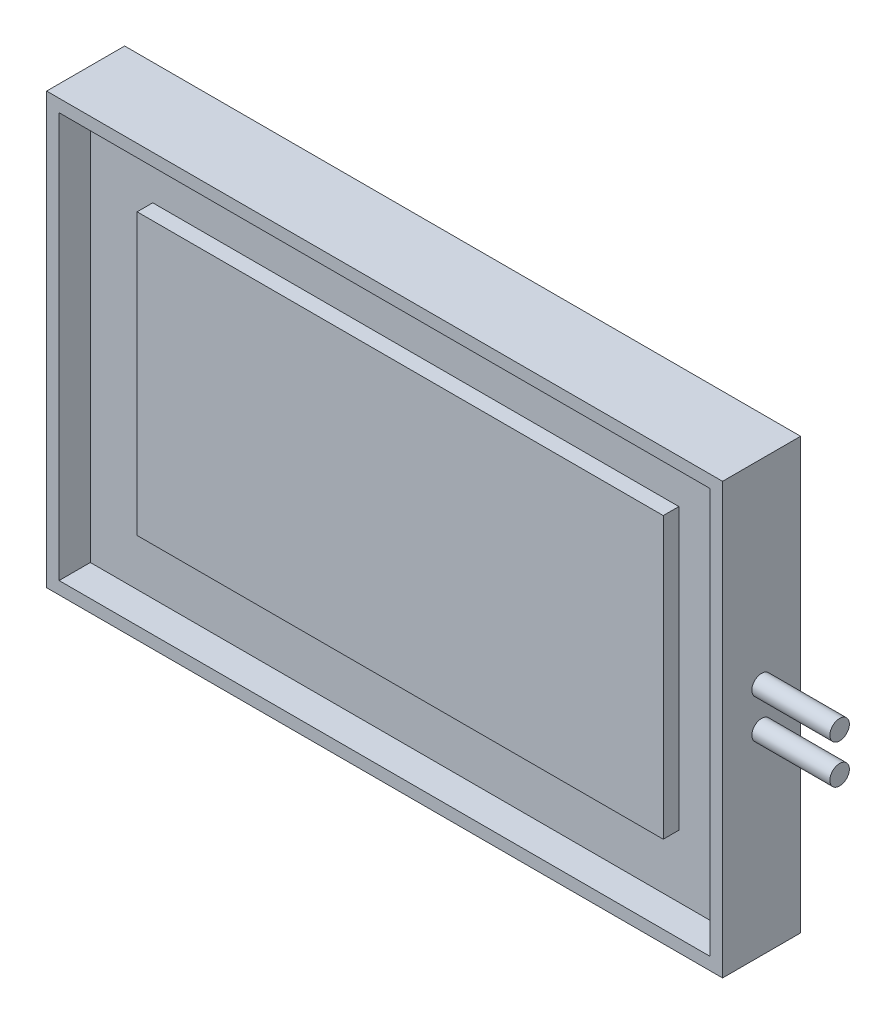
ISO-10303-21;
HEADER;
FILE_DESCRIPTION(('STEP AP214'),'2;1');
FILE_NAME('part.step','',(''),(''),'','','');
FILE_SCHEMA(('AUTOMOTIVE_DESIGN { 1 0 10303 214 1 1 1 1 }'));
ENDSEC;
DATA;
#1=APPLICATION_CONTEXT('core data for automotive mechanical design processes');
#2=APPLICATION_PROTOCOL_DEFINITION('international standard','automotive_design',2000,#1);
#3=PRODUCT_CONTEXT('',#1,'mechanical');
#4=PRODUCT('Part','Part','',(#3));
#5=PRODUCT_RELATED_PRODUCT_CATEGORY('part','',(#4));
#6=PRODUCT_DEFINITION_FORMATION('','',#4);
#7=PRODUCT_DEFINITION_CONTEXT('part definition',#1,'design');
#8=PRODUCT_DEFINITION('design','',#6,#7);
#9=PRODUCT_DEFINITION_SHAPE('','',#8);
#10=(LENGTH_UNIT() NAMED_UNIT(*) SI_UNIT(.MILLI.,.METRE.));
#11=(NAMED_UNIT(*) PLANE_ANGLE_UNIT() SI_UNIT($,.RADIAN.));
#12=(NAMED_UNIT(*) SI_UNIT($,.STERADIAN.) SOLID_ANGLE_UNIT());
#13=UNCERTAINTY_MEASURE_WITH_UNIT(LENGTH_MEASURE(1.E-05),#10,'distance_accuracy_value','');
#14=(GEOMETRIC_REPRESENTATION_CONTEXT(3) GLOBAL_UNCERTAINTY_ASSIGNED_CONTEXT((#13)) GLOBAL_UNIT_ASSIGNED_CONTEXT((#10,
#11,#12)) REPRESENTATION_CONTEXT('',''));
#15=CARTESIAN_POINT('',(0.,0.,0.));
#16=DIRECTION('',(0.,0.,1.));
#17=DIRECTION('',(1.,0.,0.));
#18=AXIS2_PLACEMENT_3D('',#15,#16,#17);
#19=CARTESIAN_POINT('',(0.,0.,3.81));
#20=DIRECTION('',(0.,0.,1.));
#21=DIRECTION('',(1.,0.,0.));
#22=AXIS2_PLACEMENT_3D('',#19,#20,#21);
#23=PLANE('',#22);
#24=DIRECTION('',(0.,1.,0.));
#25=VECTOR('',#24,1.);
#26=CARTESIAN_POINT('',(-29.7623768115942,-0.393420289855083,3.81));
#27=LINE('',#26,#25);
#28=CARTESIAN_POINT('',(-29.7623768115942,-0.393420289855083,3.81));
#29=VERTEX_POINT('',#28);
#30=CARTESIAN_POINT('',(-29.7623768115942,32.5745797101449,3.81));
#31=VERTEX_POINT('',#30);
#32=EDGE_CURVE('E157',#29,#31,#27,.T.);
#33=ORIENTED_EDGE('',*,*,#32,.T.);
#34=DIRECTION('',(-1.,0.,0.));
#35=VECTOR('',#34,1.);
#36=CARTESIAN_POINT('',(-29.7623768115942,32.5745797101449,3.81));
#37=LINE('',#36,#35);
#38=CARTESIAN_POINT('',(-82.7303768115942,32.5745797101449,3.81));
#39=VERTEX_POINT('',#38);
#40=EDGE_CURVE('E160',#31,#39,#37,.T.);
#41=ORIENTED_EDGE('',*,*,#40,.T.);
#42=DIRECTION('',(0.,-1.,0.));
#43=VECTOR('',#42,1.);
#44=CARTESIAN_POINT('',(-82.7303768115942,32.5745797101449,3.81));
#45=LINE('',#44,#43);
#46=CARTESIAN_POINT('',(-82.7303768115942,-0.393420289855086,3.81));
#47=VERTEX_POINT('',#46);
#48=EDGE_CURVE('E164',#39,#47,#45,.T.);
#49=ORIENTED_EDGE('',*,*,#48,.T.);
#50=DIRECTION('',(1.,0.,0.));
#51=VECTOR('',#50,1.);
#52=CARTESIAN_POINT('',(-82.7303768115942,-0.393420289855086,3.81));
#53=LINE('',#52,#51);
#54=EDGE_CURVE('E167',#47,#29,#53,.T.);
#55=ORIENTED_EDGE('',*,*,#54,.T.);
#56=EDGE_LOOP('',(#33,#41,#49,#55));
#57=FACE_BOUND('',#56,.T.);
#58=DIRECTION('',(-1.,0.,0.));
#59=VECTOR('',#58,1.);
#60=CARTESIAN_POINT('',(-34.8423768115942,27.4945797101449,3.81));
#61=LINE('',#60,#59);
#62=CARTESIAN_POINT('',(-34.8423768115942,27.4945797101449,3.81));
#63=VERTEX_POINT('',#62);
#64=CARTESIAN_POINT('',(-77.6503768115942,27.4945797101449,3.81));
#65=VERTEX_POINT('',#64);
#66=EDGE_CURVE('E472',#63,#65,#61,.T.);
#67=ORIENTED_EDGE('',*,*,#66,.F.);
#68=DIRECTION('',(0.,1.,0.));
#69=VECTOR('',#68,1.);
#70=CARTESIAN_POINT('',(-34.8423768115942,4.68657971014492,3.81));
#71=LINE('',#70,#69);
#72=CARTESIAN_POINT('',(-34.8423768115942,4.68657971014492,3.81));
#73=VERTEX_POINT('',#72);
#74=EDGE_CURVE('E149',#73,#63,#71,.T.);
#75=ORIENTED_EDGE('',*,*,#74,.F.);
#76=DIRECTION('',(1.,0.,0.));
#77=VECTOR('',#76,1.);
#78=CARTESIAN_POINT('',(-77.6503768115942,4.68657971014491,3.81));
#79=LINE('',#78,#77);
#80=CARTESIAN_POINT('',(-77.6503768115942,4.68657971014491,3.81));
#81=VERTEX_POINT('',#80);
#82=EDGE_CURVE('E145',#81,#73,#79,.T.);
#83=ORIENTED_EDGE('',*,*,#82,.F.);
#84=DIRECTION('',(0.,-1.,0.));
#85=VECTOR('',#84,1.);
#86=CARTESIAN_POINT('',(-77.6503768115942,27.4945797101449,3.81));
#87=LINE('',#86,#85);
#88=EDGE_CURVE('E469',#65,#81,#87,.T.);
#89=ORIENTED_EDGE('',*,*,#88,.F.);
#90=EDGE_LOOP('',(#67,#75,#83,#89));
#91=FACE_BOUND('',#90,.T.);
#92=ADVANCED_FACE('F37',(#57,#91),#23,.T.);
#93=CARTESIAN_POINT('',(-28.7463768115942,33.5905797101449,6.35));
#94=DIRECTION('',(-1.,0.,0.));
#95=DIRECTION('',(0.,-1.,0.));
#96=AXIS2_PLACEMENT_3D('',#93,#94,#95);
#97=PLANE('',#96);
#98=DIRECTION('',(0.,1.,0.));
#99=VECTOR('',#98,1.);
#100=CARTESIAN_POINT('',(-28.7463768115942,33.5905797101449,0.));
#101=LINE('',#100,#99);
#102=CARTESIAN_POINT('',(-28.7463768115942,-1.40942028985509,0.));
#103=VERTEX_POINT('',#102);
#104=CARTESIAN_POINT('',(-28.7463768115942,33.5905797101449,0.));
#105=VERTEX_POINT('',#104);
#106=EDGE_CURVE('E213',#103,#105,#101,.T.);
#107=ORIENTED_EDGE('',*,*,#106,.T.);
#108=DIRECTION('',(0.,0.,-1.));
#109=VECTOR('',#108,1.);
#110=CARTESIAN_POINT('',(-28.7463768115942,33.5905797101449,6.35));
#111=LINE('',#110,#109);
#112=CARTESIAN_POINT('',(-28.7463768115942,33.5905797101449,6.35));
#113=VERTEX_POINT('',#112);
#114=EDGE_CURVE('E218',#113,#105,#111,.T.);
#115=ORIENTED_EDGE('',*,*,#114,.F.);
#116=DIRECTION('',(0.,1.,0.));
#117=VECTOR('',#116,1.);
#118=CARTESIAN_POINT('',(-28.7463768115942,33.5905797101449,6.35));
#119=LINE('',#118,#117);
#120=CARTESIAN_POINT('',(-28.7463768115942,-1.40942028985509,6.35));
#121=VERTEX_POINT('',#120);
#122=EDGE_CURVE('E204',#121,#113,#119,.T.);
#123=ORIENTED_EDGE('',*,*,#122,.F.);
#124=DIRECTION('',(0.,0.,-1.));
#125=VECTOR('',#124,1.);
#126=CARTESIAN_POINT('',(-28.7463768115942,-1.40942028985509,6.35));
#127=LINE('',#126,#125);
#128=EDGE_CURVE('E221',#121,#103,#127,.T.);
#129=ORIENTED_EDGE('',*,*,#128,.T.);
#130=EDGE_LOOP('',(#107,#115,#123,#129));
#131=FACE_BOUND('',#130,.T.);
#132=CARTESIAN_POINT('',(-28.7463768115942,17.6780797101449,3.175));
#133=DIRECTION('',(-1.,0.,0.));
#134=DIRECTION('',(0.,-1.,0.));
#135=AXIS2_PLACEMENT_3D('',#132,#133,#134);
#136=CIRCLE('',#135,0.79375);
#137=CARTESIAN_POINT('',(-28.7463768115942,16.8843297101449,3.175));
#138=VERTEX_POINT('',#137);
#139=EDGE_CURVE('E45',#138,#138,#136,.F.);
#140=ORIENTED_EDGE('',*,*,#139,.F.);
#141=EDGE_LOOP('',(#140));
#142=FACE_BOUND('',#141,.T.);
#143=CARTESIAN_POINT('',(-28.7463768115942,14.5030797101449,3.175));
#144=DIRECTION('',(-1.,0.,0.));
#145=DIRECTION('',(0.,-1.,0.));
#146=AXIS2_PLACEMENT_3D('',#143,#144,#145);
#147=CIRCLE('',#146,0.79375);
#148=CARTESIAN_POINT('',(-28.7463768115942,13.7093297101449,3.175));
#149=VERTEX_POINT('',#148);
#150=EDGE_CURVE('E11',#149,#149,#147,.F.);
#151=ORIENTED_EDGE('',*,*,#150,.F.);
#152=EDGE_LOOP('',(#151));
#153=FACE_BOUND('',#152,.T.);
#154=ADVANCED_FACE('F231',(#131,#142,#153),#97,.F.);
#155=CARTESIAN_POINT('',(-83.7463768115942,33.5905797101449,6.35));
#156=DIRECTION('',(1.,0.,0.));
#157=DIRECTION('',(0.,1.,0.));
#158=AXIS2_PLACEMENT_3D('',#155,#156,#157);
#159=PLANE('',#158);
#160=DIRECTION('',(0.,-1.,0.));
#161=VECTOR('',#160,1.);
#162=CARTESIAN_POINT('',(-83.7463768115942,33.5905797101449,0.));
#163=LINE('',#162,#161);
#164=CARTESIAN_POINT('',(-83.7463768115942,33.5905797101449,0.));
#165=VERTEX_POINT('',#164);
#166=CARTESIAN_POINT('',(-83.7463768115942,-1.40942028985509,0.));
#167=VERTEX_POINT('',#166);
#168=EDGE_CURVE('E197',#165,#167,#163,.T.);
#169=ORIENTED_EDGE('',*,*,#168,.T.);
#170=DIRECTION('',(0.,0.,-1.));
#171=VECTOR('',#170,1.);
#172=CARTESIAN_POINT('',(-83.7463768115942,-1.40942028985509,6.35));
#173=LINE('',#172,#171);
#174=CARTESIAN_POINT('',(-83.7463768115942,-1.40942028985509,6.35));
#175=VERTEX_POINT('',#174);
#176=EDGE_CURVE('E224',#175,#167,#173,.T.);
#177=ORIENTED_EDGE('',*,*,#176,.F.);
#178=DIRECTION('',(0.,-1.,0.));
#179=VECTOR('',#178,1.);
#180=CARTESIAN_POINT('',(-83.7463768115942,33.5905797101449,6.35));
#181=LINE('',#180,#179);
#182=CARTESIAN_POINT('',(-83.7463768115942,33.5905797101449,6.35));
#183=VERTEX_POINT('',#182);
#184=EDGE_CURVE('E198',#183,#175,#181,.T.);
#185=ORIENTED_EDGE('',*,*,#184,.F.);
#186=DIRECTION('',(0.,0.,-1.));
#187=VECTOR('',#186,1.);
#188=CARTESIAN_POINT('',(-83.7463768115942,33.5905797101449,6.35));
#189=LINE('',#188,#187);
#190=EDGE_CURVE('E208',#183,#165,#189,.T.);
#191=ORIENTED_EDGE('',*,*,#190,.T.);
#192=EDGE_LOOP('',(#169,#177,#185,#191));
#193=FACE_BOUND('',#192,.T.);
#194=ADVANCED_FACE('F39',(#193),#159,.F.);
#195=CARTESIAN_POINT('',(-83.7463768115942,-1.40942028985509,6.35));
#196=DIRECTION('',(0.,1.,0.));
#197=DIRECTION('',(0.,0.,1.));
#198=AXIS2_PLACEMENT_3D('',#195,#196,#197);
#199=PLANE('',#198);
#200=DIRECTION('',(1.,0.,0.));
#201=VECTOR('',#200,1.);
#202=CARTESIAN_POINT('',(-83.7463768115942,-1.40942028985509,0.));
#203=LINE('',#202,#201);
#204=EDGE_CURVE('E211',#167,#103,#203,.T.);
#205=ORIENTED_EDGE('',*,*,#204,.T.);
#206=ORIENTED_EDGE('',*,*,#128,.F.);
#207=DIRECTION('',(1.,0.,0.));
#208=VECTOR('',#207,1.);
#209=CARTESIAN_POINT('',(-83.7463768115942,-1.40942028985509,6.35));
#210=LINE('',#209,#208);
#211=EDGE_CURVE('E201',#175,#121,#210,.T.);
#212=ORIENTED_EDGE('',*,*,#211,.F.);
#213=ORIENTED_EDGE('',*,*,#176,.T.);
#214=EDGE_LOOP('',(#205,#206,#212,#213));
#215=FACE_BOUND('',#214,.T.);
#216=ADVANCED_FACE('F309',(#215),#199,.F.);
#217=CARTESIAN_POINT('',(-83.7463768115942,33.5905797101449,6.35));
#218=DIRECTION('',(0.,-1.,0.));
#219=DIRECTION('',(0.,0.,-1.));
#220=AXIS2_PLACEMENT_3D('',#217,#218,#219);
#221=PLANE('',#220);
#222=DIRECTION('',(-1.,0.,0.));
#223=VECTOR('',#222,1.);
#224=CARTESIAN_POINT('',(-83.7463768115942,33.5905797101449,0.));
#225=LINE('',#224,#223);
#226=EDGE_CURVE('E202',#105,#165,#225,.T.);
#227=ORIENTED_EDGE('',*,*,#226,.T.);
#228=ORIENTED_EDGE('',*,*,#190,.F.);
#229=DIRECTION('',(-1.,0.,0.));
#230=VECTOR('',#229,1.);
#231=CARTESIAN_POINT('',(-83.7463768115942,33.5905797101449,6.35));
#232=LINE('',#231,#230);
#233=EDGE_CURVE('E206',#113,#183,#232,.T.);
#234=ORIENTED_EDGE('',*,*,#233,.F.);
#235=ORIENTED_EDGE('',*,*,#114,.T.);
#236=EDGE_LOOP('',(#227,#228,#234,#235));
#237=FACE_BOUND('',#236,.T.);
#238=ADVANCED_FACE('F304',(#237),#221,.F.);
#239=CARTESIAN_POINT('',(0.,0.,6.35));
#240=DIRECTION('',(0.,0.,1.));
#241=DIRECTION('',(1.,0.,0.));
#242=AXIS2_PLACEMENT_3D('',#239,#240,#241);
#243=PLANE('',#242);
#244=DIRECTION('',(0.,1.,0.));
#245=VECTOR('',#244,1.);
#246=CARTESIAN_POINT('',(-29.7623768115942,-0.393420289855083,6.35));
#247=LINE('',#246,#245);
#248=CARTESIAN_POINT('',(-29.7623768115942,-0.393420289855083,6.35));
#249=VERTEX_POINT('',#248);
#250=CARTESIAN_POINT('',(-29.7623768115942,32.5745797101449,6.35));
#251=VERTEX_POINT('',#250);
#252=EDGE_CURVE('E60',#249,#251,#247,.T.);
#253=ORIENTED_EDGE('',*,*,#252,.F.);
#254=DIRECTION('',(1.,0.,0.));
#255=VECTOR('',#254,1.);
#256=CARTESIAN_POINT('',(-82.7303768115942,-0.393420289855086,6.35));
#257=LINE('',#256,#255);
#258=CARTESIAN_POINT('',(-82.7303768115942,-0.393420289855086,6.35));
#259=VERTEX_POINT('',#258);
#260=EDGE_CURVE('E161',#259,#249,#257,.T.);
#261=ORIENTED_EDGE('',*,*,#260,.F.);
#262=DIRECTION('',(0.,-1.,0.));
#263=VECTOR('',#262,1.);
#264=CARTESIAN_POINT('',(-82.7303768115942,32.5745797101449,6.35));
#265=LINE('',#264,#263);
#266=CARTESIAN_POINT('',(-82.7303768115942,32.5745797101449,6.35));
#267=VERTEX_POINT('',#266);
#268=EDGE_CURVE('E173',#267,#259,#265,.T.);
#269=ORIENTED_EDGE('',*,*,#268,.F.);
#270=DIRECTION('',(-1.,0.,0.));
#271=VECTOR('',#270,1.);
#272=CARTESIAN_POINT('',(-29.7623768115942,32.5745797101449,6.35));
#273=LINE('',#272,#271);
#274=EDGE_CURVE('E152',#251,#267,#273,.T.);
#275=ORIENTED_EDGE('',*,*,#274,.F.);
#276=EDGE_LOOP('',(#253,#261,#269,#275));
#277=FACE_BOUND('',#276,.T.);
#278=ORIENTED_EDGE('',*,*,#184,.T.);
#279=ORIENTED_EDGE('',*,*,#211,.T.);
#280=ORIENTED_EDGE('',*,*,#122,.T.);
#281=ORIENTED_EDGE('',*,*,#233,.T.);
#282=EDGE_LOOP('',(#278,#279,#280,#281));
#283=FACE_BOUND('',#282,.T.);
#284=ADVANCED_FACE('F293',(#277,#283),#243,.T.);
#285=CARTESIAN_POINT('',(0.,0.,0.));
#286=DIRECTION('',(0.,0.,1.));
#287=DIRECTION('',(1.,0.,0.));
#288=AXIS2_PLACEMENT_3D('',#285,#286,#287);
#289=PLANE('',#288);
#290=CARTESIAN_POINT('',(-56.2463768115942,16.0905797101449,0.));
#291=DIRECTION('',(0.,0.,-1.));
#292=DIRECTION('',(-1.,0.,0.));
#293=AXIS2_PLACEMENT_3D('',#290,#291,#292);
#294=CIRCLE('',#293,1.58749999340341);
#295=CARTESIAN_POINT('',(-57.8338768049976,16.0905797101449,0.));
#296=VERTEX_POINT('',#295);
#297=EDGE_CURVE('E180',#296,#296,#294,.T.);
#298=ORIENTED_EDGE('',*,*,#297,.F.);
#299=EDGE_LOOP('',(#298));
#300=FACE_BOUND('',#299,.T.);
#301=ORIENTED_EDGE('',*,*,#168,.F.);
#302=ORIENTED_EDGE('',*,*,#226,.F.);
#303=ORIENTED_EDGE('',*,*,#106,.F.);
#304=ORIENTED_EDGE('',*,*,#204,.F.);
#305=EDGE_LOOP('',(#301,#302,#303,#304));
#306=FACE_BOUND('',#305,.T.);
#307=ADVANCED_FACE('F290',(#300,#306),#289,.F.);
#308=CARTESIAN_POINT('',(-22.3963768115942,17.6780797101449,3.175));
#309=DIRECTION('',(-1.,0.,0.));
#310=DIRECTION('',(0.,-1.,0.));
#311=AXIS2_PLACEMENT_3D('',#308,#309,#310);
#312=CYLINDRICAL_SURFACE('',#311,0.79375);
#313=CARTESIAN_POINT('',(-22.3963768115942,17.6780797101449,3.175));
#314=DIRECTION('',(1.,0.,0.));
#315=DIRECTION('',(0.,1.,0.));
#316=AXIS2_PLACEMENT_3D('',#313,#314,#315);
#317=CIRCLE('',#316,0.79375);
#318=CARTESIAN_POINT('',(-22.3963768115942,18.4718297101449,3.175));
#319=VERTEX_POINT('',#318);
#320=EDGE_CURVE('E194',#319,#319,#317,.T.);
#321=ORIENTED_EDGE('',*,*,#320,.F.);
#322=EDGE_LOOP('',(#321));
#323=FACE_BOUND('',#322,.T.);
#324=ORIENTED_EDGE('',*,*,#139,.T.);
#325=EDGE_LOOP('',(#324));
#326=FACE_BOUND('',#325,.T.);
#327=ADVANCED_FACE('F229',(#323,#326),#312,.T.);
#328=CARTESIAN_POINT('',(-22.3963768115942,17.6780797101449,3.175));
#329=DIRECTION('',(1.,0.,0.));
#330=DIRECTION('',(0.,1.,0.));
#331=AXIS2_PLACEMENT_3D('',#328,#329,#330);
#332=PLANE('',#331);
#333=ORIENTED_EDGE('',*,*,#320,.T.);
#334=EDGE_LOOP('',(#333));
#335=FACE_BOUND('',#334,.T.);
#336=ADVANCED_FACE('F241',(#335),#332,.T.);
#337=CARTESIAN_POINT('',(-22.3963768115942,14.5030797101449,3.175));
#338=DIRECTION('',(-1.,0.,0.));
#339=DIRECTION('',(0.,-1.,0.));
#340=AXIS2_PLACEMENT_3D('',#337,#338,#339);
#341=CYLINDRICAL_SURFACE('',#340,0.79375);
#342=CARTESIAN_POINT('',(-22.3963768115942,14.5030797101449,3.175));
#343=DIRECTION('',(1.,0.,0.));
#344=DIRECTION('',(0.,1.,0.));
#345=AXIS2_PLACEMENT_3D('',#342,#343,#344);
#346=CIRCLE('',#345,0.79375);
#347=CARTESIAN_POINT('',(-22.3963768115942,15.2968297101449,3.175));
#348=VERTEX_POINT('',#347);
#349=EDGE_CURVE('E189',#348,#348,#346,.T.);
#350=ORIENTED_EDGE('',*,*,#349,.F.);
#351=EDGE_LOOP('',(#350));
#352=FACE_BOUND('',#351,.T.);
#353=ORIENTED_EDGE('',*,*,#150,.T.);
#354=EDGE_LOOP('',(#353));
#355=FACE_BOUND('',#354,.T.);
#356=ADVANCED_FACE('F238',(#352,#355),#341,.T.);
#357=CARTESIAN_POINT('',(-22.3963768115942,14.5030797101449,3.175));
#358=DIRECTION('',(1.,0.,0.));
#359=DIRECTION('',(0.,1.,0.));
#360=AXIS2_PLACEMENT_3D('',#357,#358,#359);
#361=PLANE('',#360);
#362=ORIENTED_EDGE('',*,*,#349,.T.);
#363=EDGE_LOOP('',(#362));
#364=FACE_BOUND('',#363,.T.);
#365=ADVANCED_FACE('F240',(#364),#361,.T.);
#366=CARTESIAN_POINT('',(-56.2463768115942,16.0905797101449,0.254));
#367=DIRECTION('',(0.,0.,-1.));
#368=DIRECTION('',(-1.,0.,0.));
#369=AXIS2_PLACEMENT_3D('',#366,#367,#368);
#370=CYLINDRICAL_SURFACE('',#369,1.58749999340341);
#371=CARTESIAN_POINT('',(-56.2463768115942,16.0905797101449,0.254));
#372=DIRECTION('',(0.,0.,-1.));
#373=DIRECTION('',(-1.,0.,0.));
#374=AXIS2_PLACEMENT_3D('',#371,#372,#373);
#375=CIRCLE('',#374,1.58749999340341);
#376=CARTESIAN_POINT('',(-57.8338768049976,16.0905797101449,0.254));
#377=VERTEX_POINT('',#376);
#378=EDGE_CURVE('E186',#377,#377,#375,.T.);
#379=ORIENTED_EDGE('',*,*,#378,.F.);
#380=EDGE_LOOP('',(#379));
#381=FACE_BOUND('',#380,.T.);
#382=ORIENTED_EDGE('',*,*,#297,.T.);
#383=EDGE_LOOP('',(#382));
#384=FACE_BOUND('',#383,.T.);
#385=ADVANCED_FACE('F248',(#381,#384),#370,.F.);
#386=CARTESIAN_POINT('',(-56.2463768115942,16.0905797101449,0.254));
#387=DIRECTION('',(0.,0.,-1.));
#388=DIRECTION('',(-1.,0.,0.));
#389=AXIS2_PLACEMENT_3D('',#386,#387,#388);
#390=PLANE('',#389);
#391=ORIENTED_EDGE('',*,*,#378,.T.);
#392=EDGE_LOOP('',(#391));
#393=FACE_BOUND('',#392,.T.);
#394=ADVANCED_FACE('F278',(#393),#390,.T.);
#395=CARTESIAN_POINT('',(-29.7623768115942,-0.393420289855083,3.81));
#396=DIRECTION('',(1.,0.,0.));
#397=DIRECTION('',(0.,0.,-1.));
#398=AXIS2_PLACEMENT_3D('',#395,#396,#397);
#399=PLANE('',#398);
#400=ORIENTED_EDGE('',*,*,#252,.T.);
#401=DIRECTION('',(0.,0.,1.));
#402=VECTOR('',#401,1.);
#403=CARTESIAN_POINT('',(-29.7623768115942,32.5745797101449,3.81));
#404=LINE('',#403,#402);
#405=EDGE_CURVE('E169',#31,#251,#404,.T.);
#406=ORIENTED_EDGE('',*,*,#405,.F.);
#407=ORIENTED_EDGE('',*,*,#32,.F.);
#408=DIRECTION('',(0.,0.,1.));
#409=VECTOR('',#408,1.);
#410=CARTESIAN_POINT('',(-29.7623768115942,-0.393420289855083,3.81));
#411=LINE('',#410,#409);
#412=EDGE_CURVE('E178',#29,#249,#411,.T.);
#413=ORIENTED_EDGE('',*,*,#412,.T.);
#414=EDGE_LOOP('',(#400,#406,#407,#413));
#415=FACE_BOUND('',#414,.T.);
#416=ADVANCED_FACE('F267',(#415),#399,.F.);
#417=CARTESIAN_POINT('',(-82.7303768115942,-0.393420289855086,3.81));
#418=DIRECTION('',(0.,-1.,0.));
#419=DIRECTION('',(1.,0.,0.));
#420=AXIS2_PLACEMENT_3D('',#417,#418,#419);
#421=PLANE('',#420);
#422=ORIENTED_EDGE('',*,*,#260,.T.);
#423=ORIENTED_EDGE('',*,*,#412,.F.);
#424=ORIENTED_EDGE('',*,*,#54,.F.);
#425=DIRECTION('',(0.,0.,1.));
#426=VECTOR('',#425,1.);
#427=CARTESIAN_POINT('',(-82.7303768115942,-0.393420289855086,3.81));
#428=LINE('',#427,#426);
#429=EDGE_CURVE('E181',#47,#259,#428,.T.);
#430=ORIENTED_EDGE('',*,*,#429,.T.);
#431=EDGE_LOOP('',(#422,#423,#424,#430));
#432=FACE_BOUND('',#431,.T.);
#433=ADVANCED_FACE('F263',(#432),#421,.F.);
#434=CARTESIAN_POINT('',(-82.7303768115942,32.5745797101449,3.81));
#435=DIRECTION('',(-1.,0.,0.));
#436=DIRECTION('',(0.,0.,1.));
#437=AXIS2_PLACEMENT_3D('',#434,#435,#436);
#438=PLANE('',#437);
#439=ORIENTED_EDGE('',*,*,#268,.T.);
#440=ORIENTED_EDGE('',*,*,#429,.F.);
#441=ORIENTED_EDGE('',*,*,#48,.F.);
#442=DIRECTION('',(0.,0.,1.));
#443=VECTOR('',#442,1.);
#444=CARTESIAN_POINT('',(-82.7303768115942,32.5745797101449,3.81));
#445=LINE('',#444,#443);
#446=EDGE_CURVE('E183',#39,#267,#445,.T.);
#447=ORIENTED_EDGE('',*,*,#446,.T.);
#448=EDGE_LOOP('',(#439,#440,#441,#447));
#449=FACE_BOUND('',#448,.T.);
#450=ADVANCED_FACE('F266',(#449),#438,.F.);
#451=CARTESIAN_POINT('',(-29.7623768115942,32.5745797101449,3.81));
#452=DIRECTION('',(0.,1.,0.));
#453=DIRECTION('',(-1.,0.,0.));
#454=AXIS2_PLACEMENT_3D('',#451,#452,#453);
#455=PLANE('',#454);
#456=ORIENTED_EDGE('',*,*,#274,.T.);
#457=ORIENTED_EDGE('',*,*,#446,.F.);
#458=ORIENTED_EDGE('',*,*,#40,.F.);
#459=ORIENTED_EDGE('',*,*,#405,.T.);
#460=EDGE_LOOP('',(#456,#457,#458,#459));
#461=FACE_BOUND('',#460,.T.);
#462=ADVANCED_FACE('F271',(#461),#455,.F.);
#463=CARTESIAN_POINT('',(-34.8423768115942,4.68657971014492,5.08));
#464=DIRECTION('',(-1.,0.,0.));
#465=DIRECTION('',(0.,0.,1.));
#466=AXIS2_PLACEMENT_3D('',#463,#464,#465);
#467=PLANE('',#466);
#468=ORIENTED_EDGE('',*,*,#74,.T.);
#469=DIRECTION('',(0.,0.,-1.));
#470=VECTOR('',#469,1.);
#471=CARTESIAN_POINT('',(-34.8423768115942,27.4945797101449,5.08));
#472=LINE('',#471,#470);
#473=CARTESIAN_POINT('',(-34.8423768115942,27.4945797101449,5.08));
#474=VERTEX_POINT('',#473);
#475=EDGE_CURVE('E130',#474,#63,#472,.T.);
#476=ORIENTED_EDGE('',*,*,#475,.F.);
#477=DIRECTION('',(0.,1.,0.));
#478=VECTOR('',#477,1.);
#479=CARTESIAN_POINT('',(-34.8423768115942,4.68657971014492,5.08));
#480=LINE('',#479,#478);
#481=CARTESIAN_POINT('',(-34.8423768115942,4.68657971014492,5.08));
#482=VERTEX_POINT('',#481);
#483=EDGE_CURVE('E137',#482,#474,#480,.T.);
#484=ORIENTED_EDGE('',*,*,#483,.F.);
#485=DIRECTION('',(0.,0.,-1.));
#486=VECTOR('',#485,1.);
#487=CARTESIAN_POINT('',(-34.8423768115942,4.68657971014492,5.08));
#488=LINE('',#487,#486);
#489=EDGE_CURVE('E467',#482,#73,#488,.T.);
#490=ORIENTED_EDGE('',*,*,#489,.T.);
#491=EDGE_LOOP('',(#468,#476,#484,#490));
#492=FACE_BOUND('',#491,.T.);
#493=ADVANCED_FACE('F147',(#492),#467,.F.);
#494=CARTESIAN_POINT('',(-34.8423768115942,27.4945797101449,5.08));
#495=DIRECTION('',(0.,-1.,0.));
#496=DIRECTION('',(1.,0.,0.));
#497=AXIS2_PLACEMENT_3D('',#494,#495,#496);
#498=PLANE('',#497);
#499=ORIENTED_EDGE('',*,*,#66,.T.);
#500=DIRECTION('',(0.,0.,-1.));
#501=VECTOR('',#500,1.);
#502=CARTESIAN_POINT('',(-77.6503768115942,27.4945797101449,5.08));
#503=LINE('',#502,#501);
#504=CARTESIAN_POINT('',(-77.6503768115942,27.4945797101449,5.08));
#505=VERTEX_POINT('',#504);
#506=EDGE_CURVE('E133',#505,#65,#503,.T.);
#507=ORIENTED_EDGE('',*,*,#506,.F.);
#508=DIRECTION('',(-1.,0.,0.));
#509=VECTOR('',#508,1.);
#510=CARTESIAN_POINT('',(-34.8423768115942,27.4945797101449,5.08));
#511=LINE('',#510,#509);
#512=EDGE_CURVE('E126',#474,#505,#511,.T.);
#513=ORIENTED_EDGE('',*,*,#512,.F.);
#514=ORIENTED_EDGE('',*,*,#475,.T.);
#515=EDGE_LOOP('',(#499,#507,#513,#514));
#516=FACE_BOUND('',#515,.T.);
#517=ADVANCED_FACE('F128',(#516),#498,.F.);
#518=CARTESIAN_POINT('',(-77.6503768115942,27.4945797101449,5.08));
#519=DIRECTION('',(1.,0.,0.));
#520=DIRECTION('',(0.,0.,-1.));
#521=AXIS2_PLACEMENT_3D('',#518,#519,#520);
#522=PLANE('',#521);
#523=ORIENTED_EDGE('',*,*,#88,.T.);
#524=DIRECTION('',(0.,0.,-1.));
#525=VECTOR('',#524,1.);
#526=CARTESIAN_POINT('',(-77.6503768115942,4.68657971014491,5.08));
#527=LINE('',#526,#525);
#528=CARTESIAN_POINT('',(-77.6503768115942,4.68657971014491,5.08));
#529=VERTEX_POINT('',#528);
#530=EDGE_CURVE('E52',#529,#81,#527,.T.);
#531=ORIENTED_EDGE('',*,*,#530,.F.);
#532=DIRECTION('',(0.,-1.,0.));
#533=VECTOR('',#532,1.);
#534=CARTESIAN_POINT('',(-77.6503768115942,27.4945797101449,5.08));
#535=LINE('',#534,#533);
#536=EDGE_CURVE('E136',#505,#529,#535,.T.);
#537=ORIENTED_EDGE('',*,*,#536,.F.);
#538=ORIENTED_EDGE('',*,*,#506,.T.);
#539=EDGE_LOOP('',(#523,#531,#537,#538));
#540=FACE_BOUND('',#539,.T.);
#541=ADVANCED_FACE('F424',(#540),#522,.F.);
#542=CARTESIAN_POINT('',(-77.6503768115942,4.68657971014491,5.08));
#543=DIRECTION('',(0.,1.,0.));
#544=DIRECTION('',(-1.,0.,0.));
#545=AXIS2_PLACEMENT_3D('',#542,#543,#544);
#546=PLANE('',#545);
#547=ORIENTED_EDGE('',*,*,#82,.T.);
#548=ORIENTED_EDGE('',*,*,#489,.F.);
#549=DIRECTION('',(1.,0.,0.));
#550=VECTOR('',#549,1.);
#551=CARTESIAN_POINT('',(-77.6503768115942,4.68657971014491,5.08));
#552=LINE('',#551,#550);
#553=EDGE_CURVE('E141',#529,#482,#552,.T.);
#554=ORIENTED_EDGE('',*,*,#553,.F.);
#555=ORIENTED_EDGE('',*,*,#530,.T.);
#556=EDGE_LOOP('',(#547,#548,#554,#555));
#557=FACE_BOUND('',#556,.T.);
#558=ADVANCED_FACE('F432',(#557),#546,.F.);
#559=CARTESIAN_POINT('',(0.,0.,5.08));
#560=DIRECTION('',(0.,0.,1.));
#561=DIRECTION('',(1.,0.,0.));
#562=AXIS2_PLACEMENT_3D('',#559,#560,#561);
#563=PLANE('',#562);
#564=ORIENTED_EDGE('',*,*,#483,.T.);
#565=ORIENTED_EDGE('',*,*,#512,.T.);
#566=ORIENTED_EDGE('',*,*,#536,.T.);
#567=ORIENTED_EDGE('',*,*,#553,.T.);
#568=EDGE_LOOP('',(#564,#565,#566,#567));
#569=FACE_BOUND('',#568,.T.);
#570=ADVANCED_FACE('F140',(#569),#563,.T.);
#571=CLOSED_SHELL('',(#92,#154,#194,#216,#238,#284,#307,#327,#336,#356,#365,#385,#394,#416,#433,
#450,#462,#493,#517,#541,#558,#570));
#572=MANIFOLD_SOLID_BREP('B2',#571);
#573=ADVANCED_BREP_SHAPE_REPRESENTATION('',(#18,#572),#14);
#574=SHAPE_DEFINITION_REPRESENTATION(#9,#573);
ENDSEC;
END-ISO-10303-21;
